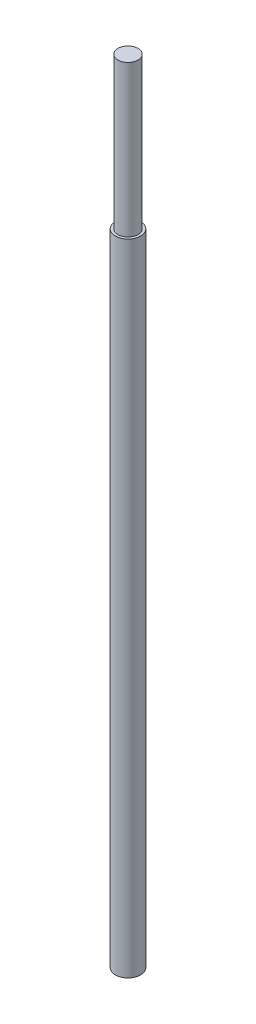
ISO-10303-21;
HEADER;
FILE_DESCRIPTION(('STEP AP214'),'2;1');
FILE_NAME('part.step','',(''),(''),'','','');
FILE_SCHEMA(('AUTOMOTIVE_DESIGN { 1 0 10303 214 1 1 1 1 }'));
ENDSEC;
DATA;
#1=APPLICATION_CONTEXT('core data for automotive mechanical design processes');
#2=APPLICATION_PROTOCOL_DEFINITION('international standard','automotive_design',2000,#1);
#3=PRODUCT_CONTEXT('',#1,'mechanical');
#4=PRODUCT('Part','Part','',(#3));
#5=PRODUCT_RELATED_PRODUCT_CATEGORY('part','',(#4));
#6=PRODUCT_DEFINITION_FORMATION('','',#4);
#7=PRODUCT_DEFINITION_CONTEXT('part definition',#1,'design');
#8=PRODUCT_DEFINITION('design','',#6,#7);
#9=PRODUCT_DEFINITION_SHAPE('','',#8);
#10=(LENGTH_UNIT() NAMED_UNIT(*) SI_UNIT(.MILLI.,.METRE.));
#11=(NAMED_UNIT(*) PLANE_ANGLE_UNIT() SI_UNIT($,.RADIAN.));
#12=(NAMED_UNIT(*) SI_UNIT($,.STERADIAN.) SOLID_ANGLE_UNIT());
#13=UNCERTAINTY_MEASURE_WITH_UNIT(LENGTH_MEASURE(1.E-05),#10,'distance_accuracy_value','');
#14=(GEOMETRIC_REPRESENTATION_CONTEXT(3) GLOBAL_UNCERTAINTY_ASSIGNED_CONTEXT((#13)) GLOBAL_UNIT_ASSIGNED_CONTEXT((#10,
#11,#12)) REPRESENTATION_CONTEXT('',''));
#15=CARTESIAN_POINT('',(0.,0.,0.));
#16=DIRECTION('',(0.,0.,1.));
#17=DIRECTION('',(1.,0.,0.));
#18=AXIS2_PLACEMENT_3D('',#15,#16,#17);
#19=CARTESIAN_POINT('',(0.,254.,0.));
#20=DIRECTION('',(0.,-1.,0.));
#21=DIRECTION('',(0.,0.,-1.));
#22=AXIS2_PLACEMENT_3D('',#19,#20,#21);
#23=CYLINDRICAL_SURFACE('',#22,5.);
#24=CARTESIAN_POINT('',(0.,254.,0.));
#25=DIRECTION('',(0.,1.,0.));
#26=DIRECTION('',(0.,0.,1.));
#27=AXIS2_PLACEMENT_3D('',#24,#25,#26);
#28=CIRCLE('',#27,5.);
#29=CARTESIAN_POINT('',(0.,254.,5.));
#30=VERTEX_POINT('',#29);
#31=EDGE_CURVE('E37',#30,#30,#28,.T.);
#32=ORIENTED_EDGE('',*,*,#31,.F.);
#33=EDGE_LOOP('',(#32));
#34=FACE_BOUND('',#33,.T.);
#35=CARTESIAN_POINT('',(0.,0.,0.));
#36=DIRECTION('',(0.,1.,0.));
#37=DIRECTION('',(0.,0.,1.));
#38=AXIS2_PLACEMENT_3D('',#35,#36,#37);
#39=CIRCLE('',#38,5.);
#40=CARTESIAN_POINT('',(0.,0.,5.));
#41=VERTEX_POINT('',#40);
#42=EDGE_CURVE('E33',#41,#41,#39,.T.);
#43=ORIENTED_EDGE('',*,*,#42,.T.);
#44=EDGE_LOOP('',(#43));
#45=FACE_BOUND('',#44,.T.);
#46=ADVANCED_FACE('F30',(#34,#45),#23,.T.);
#47=CARTESIAN_POINT('',(0.,254.,0.));
#48=DIRECTION('',(0.,1.,0.));
#49=DIRECTION('',(0.,0.,1.));
#50=AXIS2_PLACEMENT_3D('',#47,#48,#49);
#51=PLANE('',#50);
#52=CARTESIAN_POINT('',(0.,254.,0.));
#53=DIRECTION('',(0.,1.,0.));
#54=DIRECTION('',(0.,0.,1.));
#55=AXIS2_PLACEMENT_3D('',#52,#53,#54);
#56=CIRCLE('',#55,4.);
#57=CARTESIAN_POINT('',(0.,254.,4.));
#58=VERTEX_POINT('',#57);
#59=EDGE_CURVE('E10',#58,#58,#56,.T.);
#60=ORIENTED_EDGE('',*,*,#59,.F.);
#61=EDGE_LOOP('',(#60));
#62=FACE_BOUND('',#61,.T.);
#63=ORIENTED_EDGE('',*,*,#31,.T.);
#64=EDGE_LOOP('',(#63));
#65=FACE_BOUND('',#64,.T.);
#66=ADVANCED_FACE('F54',(#62,#65),#51,.T.);
#67=CARTESIAN_POINT('',(0.,0.,0.));
#68=DIRECTION('',(0.,1.,0.));
#69=DIRECTION('',(0.,0.,1.));
#70=AXIS2_PLACEMENT_3D('',#67,#68,#69);
#71=PLANE('',#70);
#72=ORIENTED_EDGE('',*,*,#42,.F.);
#73=EDGE_LOOP('',(#72));
#74=FACE_BOUND('',#73,.T.);
#75=ADVANCED_FACE('F51',(#74),#71,.F.);
#76=CARTESIAN_POINT('',(0.,314.,0.));
#77=DIRECTION('',(0.,-1.,0.));
#78=DIRECTION('',(0.,0.,-1.));
#79=AXIS2_PLACEMENT_3D('',#76,#77,#78);
#80=CYLINDRICAL_SURFACE('',#79,4.);
#81=CARTESIAN_POINT('',(0.,314.,0.));
#82=DIRECTION('',(0.,1.,0.));
#83=DIRECTION('',(0.,0.,1.));
#84=AXIS2_PLACEMENT_3D('',#81,#82,#83);
#85=CIRCLE('',#84,4.);
#86=CARTESIAN_POINT('',(0.,314.,4.));
#87=VERTEX_POINT('',#86);
#88=EDGE_CURVE('E43',#87,#87,#85,.T.);
#89=ORIENTED_EDGE('',*,*,#88,.F.);
#90=EDGE_LOOP('',(#89));
#91=FACE_BOUND('',#90,.T.);
#92=ORIENTED_EDGE('',*,*,#59,.T.);
#93=EDGE_LOOP('',(#92));
#94=FACE_BOUND('',#93,.T.);
#95=ADVANCED_FACE('F53',(#91,#94),#80,.T.);
#96=CARTESIAN_POINT('',(0.,314.,0.));
#97=DIRECTION('',(0.,1.,0.));
#98=DIRECTION('',(0.,0.,1.));
#99=AXIS2_PLACEMENT_3D('',#96,#97,#98);
#100=PLANE('',#99);
#101=ORIENTED_EDGE('',*,*,#88,.T.);
#102=EDGE_LOOP('',(#101));
#103=FACE_BOUND('',#102,.T.);
#104=ADVANCED_FACE('F59',(#103),#100,.T.);
#105=CLOSED_SHELL('',(#46,#66,#75,#95,#104));
#106=MANIFOLD_SOLID_BREP('B2',#105);
#107=ADVANCED_BREP_SHAPE_REPRESENTATION('',(#18,#106),#14);
#108=SHAPE_DEFINITION_REPRESENTATION(#9,#107);
ENDSEC;
END-ISO-10303-21;
